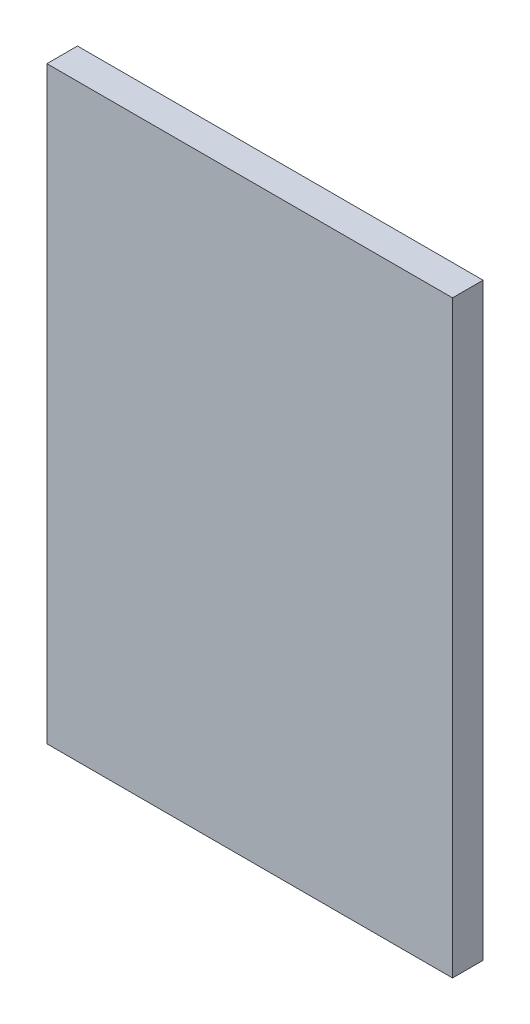
ISO-10303-21;
HEADER;
FILE_DESCRIPTION(('STEP AP214'),'2;1');
FILE_NAME('part.step','',(''),(''),'','','');
FILE_SCHEMA(('AUTOMOTIVE_DESIGN { 1 0 10303 214 1 1 1 1 }'));
ENDSEC;
DATA;
#1=APPLICATION_CONTEXT('core data for automotive mechanical design processes');
#2=APPLICATION_PROTOCOL_DEFINITION('international standard','automotive_design',2000,#1);
#3=PRODUCT_CONTEXT('',#1,'mechanical');
#4=PRODUCT('Part','Part','',(#3));
#5=PRODUCT_RELATED_PRODUCT_CATEGORY('part','',(#4));
#6=PRODUCT_DEFINITION_FORMATION('','',#4);
#7=PRODUCT_DEFINITION_CONTEXT('part definition',#1,'design');
#8=PRODUCT_DEFINITION('design','',#6,#7);
#9=PRODUCT_DEFINITION_SHAPE('','',#8);
#10=(LENGTH_UNIT() NAMED_UNIT(*) SI_UNIT(.MILLI.,.METRE.));
#11=(NAMED_UNIT(*) PLANE_ANGLE_UNIT() SI_UNIT($,.RADIAN.));
#12=(NAMED_UNIT(*) SI_UNIT($,.STERADIAN.) SOLID_ANGLE_UNIT());
#13=UNCERTAINTY_MEASURE_WITH_UNIT(LENGTH_MEASURE(1.E-05),#10,'distance_accuracy_value','');
#14=(GEOMETRIC_REPRESENTATION_CONTEXT(3) GLOBAL_UNCERTAINTY_ASSIGNED_CONTEXT((#13)) GLOBAL_UNIT_ASSIGNED_CONTEXT((#10,
#11,#12)) REPRESENTATION_CONTEXT('',''));
#15=CARTESIAN_POINT('',(0.,0.,0.));
#16=DIRECTION('',(0.,0.,1.));
#17=DIRECTION('',(1.,0.,0.));
#18=AXIS2_PLACEMENT_3D('',#15,#16,#17);
#19=CARTESIAN_POINT('',(0.5635,0.1,0.05));
#20=DIRECTION('',(-1.,0.,0.));
#21=DIRECTION('',(0.,0.,1.));
#22=AXIS2_PLACEMENT_3D('',#19,#20,#21);
#23=PLANE('',#22);
#24=DIRECTION('',(0.,0.,-1.));
#25=VECTOR('',#24,1.);
#26=CARTESIAN_POINT('',(0.5635,-0.8635,0.05));
#27=LINE('',#26,#25);
#28=CARTESIAN_POINT('',(0.5635,-0.8635,0.1));
#29=VERTEX_POINT('',#28);
#30=CARTESIAN_POINT('',(0.5635,-0.8635,0.));
#31=VERTEX_POINT('',#30);
#32=EDGE_CURVE('E20',#29,#31,#27,.T.);
#33=ORIENTED_EDGE('',*,*,#32,.T.);
#34=DIRECTION('',(0.,-1.,0.));
#35=VECTOR('',#34,1.);
#36=CARTESIAN_POINT('',(0.5635,0.1,0.));
#37=LINE('',#36,#35);
#38=CARTESIAN_POINT('',(0.5635,1.0635,0.));
#39=VERTEX_POINT('',#38);
#40=EDGE_CURVE('E81',#39,#31,#37,.T.);
#41=ORIENTED_EDGE('',*,*,#40,.F.);
#42=DIRECTION('',(0.,0.,-1.));
#43=VECTOR('',#42,1.);
#44=CARTESIAN_POINT('',(0.5635,1.0635,0.05));
#45=LINE('',#44,#43);
#46=CARTESIAN_POINT('',(0.5635,1.0635,0.1));
#47=VERTEX_POINT('',#46);
#48=EDGE_CURVE('E11',#47,#39,#45,.T.);
#49=ORIENTED_EDGE('',*,*,#48,.F.);
#50=DIRECTION('',(0.,1.,0.));
#51=VECTOR('',#50,1.);
#52=CARTESIAN_POINT('',(0.5635,0.1,0.1));
#53=LINE('',#52,#51);
#54=EDGE_CURVE('E79',#29,#47,#53,.T.);
#55=ORIENTED_EDGE('',*,*,#54,.F.);
#56=EDGE_LOOP('',(#33,#41,#49,#55));
#57=FACE_BOUND('',#56,.T.);
#58=ADVANCED_FACE('F17',(#57),#23,.F.);
#59=CARTESIAN_POINT('',(-0.1,1.0635,0.05));
#60=DIRECTION('',(0.,-1.,0.));
#61=DIRECTION('',(0.,0.,-1.));
#62=AXIS2_PLACEMENT_3D('',#59,#60,#61);
#63=PLANE('',#62);
#64=ORIENTED_EDGE('',*,*,#48,.T.);
#65=DIRECTION('',(1.,0.,0.));
#66=VECTOR('',#65,1.);
#67=CARTESIAN_POINT('',(-0.1,1.0635,0.));
#68=LINE('',#67,#66);
#69=CARTESIAN_POINT('',(-0.7635,1.0635,0.));
#70=VERTEX_POINT('',#69);
#71=EDGE_CURVE('E99',#70,#39,#68,.T.);
#72=ORIENTED_EDGE('',*,*,#71,.F.);
#73=DIRECTION('',(0.,0.,-1.));
#74=VECTOR('',#73,1.);
#75=CARTESIAN_POINT('',(-0.7635,1.0635,0.05));
#76=LINE('',#75,#74);
#77=CARTESIAN_POINT('',(-0.7635,1.0635,0.1));
#78=VERTEX_POINT('',#77);
#79=EDGE_CURVE('E27',#78,#70,#76,.T.);
#80=ORIENTED_EDGE('',*,*,#79,.F.);
#81=DIRECTION('',(-1.,0.,0.));
#82=VECTOR('',#81,1.);
#83=CARTESIAN_POINT('',(-0.1,1.0635,0.1));
#84=LINE('',#83,#82);
#85=EDGE_CURVE('E83',#47,#78,#84,.T.);
#86=ORIENTED_EDGE('',*,*,#85,.F.);
#87=EDGE_LOOP('',(#64,#72,#80,#86));
#88=FACE_BOUND('',#87,.T.);
#89=ADVANCED_FACE('F84',(#88),#63,.F.);
#90=CARTESIAN_POINT('',(-0.7635,0.1,0.05));
#91=DIRECTION('',(1.,0.,0.));
#92=DIRECTION('',(0.,1.,0.));
#93=AXIS2_PLACEMENT_3D('',#90,#91,#92);
#94=PLANE('',#93);
#95=ORIENTED_EDGE('',*,*,#79,.T.);
#96=DIRECTION('',(0.,1.,0.));
#97=VECTOR('',#96,1.);
#98=CARTESIAN_POINT('',(-0.7635,0.1,0.));
#99=LINE('',#98,#97);
#100=CARTESIAN_POINT('',(-0.7635,-0.8635,0.));
#101=VERTEX_POINT('',#100);
#102=EDGE_CURVE('E102',#101,#70,#99,.T.);
#103=ORIENTED_EDGE('',*,*,#102,.F.);
#104=DIRECTION('',(0.,0.,-1.));
#105=VECTOR('',#104,1.);
#106=CARTESIAN_POINT('',(-0.7635,-0.8635,0.05));
#107=LINE('',#106,#105);
#108=CARTESIAN_POINT('',(-0.7635,-0.8635,0.1));
#109=VERTEX_POINT('',#108);
#110=EDGE_CURVE('E64',#109,#101,#107,.T.);
#111=ORIENTED_EDGE('',*,*,#110,.F.);
#112=DIRECTION('',(0.,-1.,0.));
#113=VECTOR('',#112,1.);
#114=CARTESIAN_POINT('',(-0.7635,0.1,0.1));
#115=LINE('',#114,#113);
#116=EDGE_CURVE('E88',#78,#109,#115,.T.);
#117=ORIENTED_EDGE('',*,*,#116,.F.);
#118=EDGE_LOOP('',(#95,#103,#111,#117));
#119=FACE_BOUND('',#118,.T.);
#120=ADVANCED_FACE('F160',(#119),#94,.F.);
#121=CARTESIAN_POINT('',(-0.1,-0.8635,0.05));
#122=DIRECTION('',(0.,1.,0.));
#123=DIRECTION('',(1.,0.,0.));
#124=AXIS2_PLACEMENT_3D('',#121,#122,#123);
#125=PLANE('',#124);
#126=ORIENTED_EDGE('',*,*,#110,.T.);
#127=DIRECTION('',(-1.,0.,0.));
#128=VECTOR('',#127,1.);
#129=CARTESIAN_POINT('',(-0.1,-0.8635,0.));
#130=LINE('',#129,#128);
#131=EDGE_CURVE('E107',#31,#101,#130,.T.);
#132=ORIENTED_EDGE('',*,*,#131,.F.);
#133=ORIENTED_EDGE('',*,*,#32,.F.);
#134=DIRECTION('',(1.,0.,0.));
#135=VECTOR('',#134,1.);
#136=CARTESIAN_POINT('',(-0.1,-0.8635,0.1));
#137=LINE('',#136,#135);
#138=EDGE_CURVE('E91',#109,#29,#137,.T.);
#139=ORIENTED_EDGE('',*,*,#138,.F.);
#140=EDGE_LOOP('',(#126,#132,#133,#139));
#141=FACE_BOUND('',#140,.T.);
#142=ADVANCED_FACE('F149',(#141),#125,.F.);
#143=CARTESIAN_POINT('',(-0.1,0.1,0.));
#144=DIRECTION('',(0.,0.,1.));
#145=DIRECTION('',(1.,0.,0.));
#146=AXIS2_PLACEMENT_3D('',#143,#144,#145);
#147=PLANE('',#146);
#148=ORIENTED_EDGE('',*,*,#40,.T.);
#149=ORIENTED_EDGE('',*,*,#131,.T.);
#150=ORIENTED_EDGE('',*,*,#102,.T.);
#151=ORIENTED_EDGE('',*,*,#71,.T.);
#152=EDGE_LOOP('',(#148,#149,#150,#151));
#153=FACE_BOUND('',#152,.T.);
#154=ADVANCED_FACE('F137',(#153),#147,.F.);
#155=CARTESIAN_POINT('',(-0.1,0.1,0.1));
#156=DIRECTION('',(0.,0.,1.));
#157=DIRECTION('',(1.,0.,0.));
#158=AXIS2_PLACEMENT_3D('',#155,#156,#157);
#159=PLANE('',#158);
#160=ORIENTED_EDGE('',*,*,#54,.T.);
#161=ORIENTED_EDGE('',*,*,#85,.T.);
#162=ORIENTED_EDGE('',*,*,#116,.T.);
#163=ORIENTED_EDGE('',*,*,#138,.T.);
#164=EDGE_LOOP('',(#160,#161,#162,#163));
#165=FACE_BOUND('',#164,.T.);
#166=ADVANCED_FACE('F90',(#165),#159,.T.);
#167=CLOSED_SHELL('',(#58,#89,#120,#142,#154,#166));
#168=MANIFOLD_SOLID_BREP('B1',#167);
#169=ADVANCED_BREP_SHAPE_REPRESENTATION('',(#18,#168),#14);
#170=SHAPE_DEFINITION_REPRESENTATION(#9,#169);
ENDSEC;
END-ISO-10303-21;
